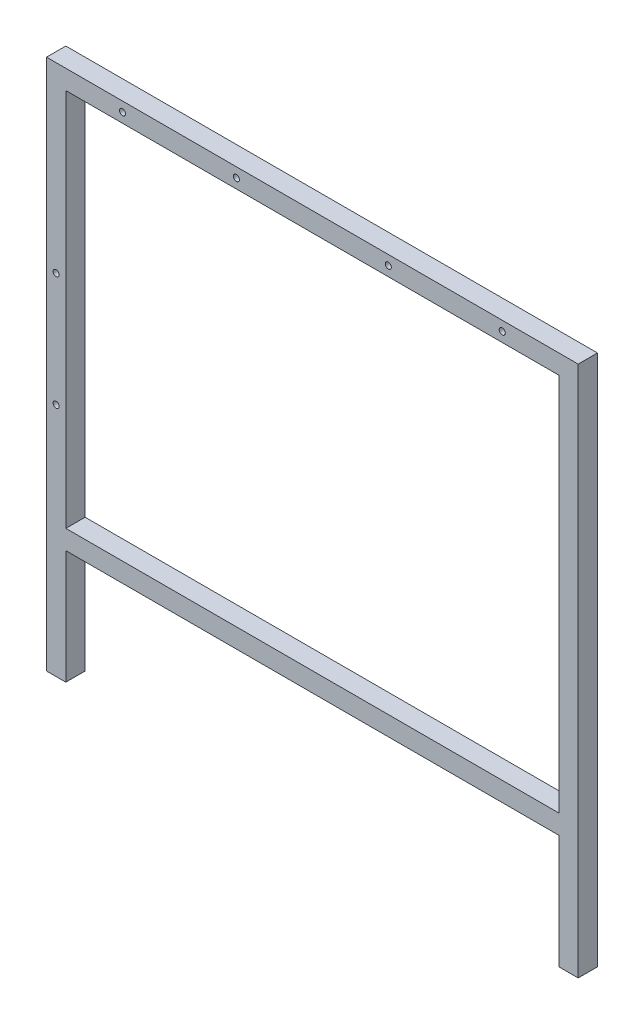
ISO-10303-21;
HEADER;
FILE_DESCRIPTION(('STEP AP214'),'2;1');
FILE_NAME('part.step','',(''),(''),'','','');
FILE_SCHEMA(('AUTOMOTIVE_DESIGN { 1 0 10303 214 1 1 1 1 }'));
ENDSEC;
DATA;
#1=APPLICATION_CONTEXT('core data for automotive mechanical design processes');
#2=APPLICATION_PROTOCOL_DEFINITION('international standard','automotive_design',2000,#1);
#3=PRODUCT_CONTEXT('',#1,'mechanical');
#4=PRODUCT('Part','Part','',(#3));
#5=PRODUCT_RELATED_PRODUCT_CATEGORY('part','',(#4));
#6=PRODUCT_DEFINITION_FORMATION('','',#4);
#7=PRODUCT_DEFINITION_CONTEXT('part definition',#1,'design');
#8=PRODUCT_DEFINITION('design','',#6,#7);
#9=PRODUCT_DEFINITION_SHAPE('','',#8);
#10=(LENGTH_UNIT() NAMED_UNIT(*) SI_UNIT(.MILLI.,.METRE.));
#11=(NAMED_UNIT(*) PLANE_ANGLE_UNIT() SI_UNIT($,.RADIAN.));
#12=(NAMED_UNIT(*) SI_UNIT($,.STERADIAN.) SOLID_ANGLE_UNIT());
#13=UNCERTAINTY_MEASURE_WITH_UNIT(LENGTH_MEASURE(1.E-05),#10,'distance_accuracy_value','');
#14=(GEOMETRIC_REPRESENTATION_CONTEXT(3) GLOBAL_UNCERTAINTY_ASSIGNED_CONTEXT((#13)) GLOBAL_UNIT_ASSIGNED_CONTEXT((#10,
#11,#12)) REPRESENTATION_CONTEXT('',''));
#15=CARTESIAN_POINT('',(0.,0.,0.));
#16=DIRECTION('',(0.,0.,1.));
#17=DIRECTION('',(1.,0.,0.));
#18=AXIS2_PLACEMENT_3D('',#15,#16,#17);
#19=CARTESIAN_POINT('',(25.4000000000001,0.,-25.4));
#20=DIRECTION('',(1.,0.,0.));
#21=DIRECTION('',(0.,0.,-1.));
#22=AXIS2_PLACEMENT_3D('',#19,#20,#21);
#23=PLANE('',#22);
#24=DIRECTION('',(0.,1.,0.));
#25=VECTOR('',#24,1.);
#26=CARTESIAN_POINT('',(25.4000000000001,0.,0.));
#27=LINE('',#26,#25);
#28=CARTESIAN_POINT('',(25.4000000000001,-700.,0.));
#29=VERTEX_POINT('',#28);
#30=CARTESIAN_POINT('',(25.4000000000001,-550.,0.));
#31=VERTEX_POINT('',#30);
#32=EDGE_CURVE('E168',#29,#31,#27,.T.);
#33=ORIENTED_EDGE('',*,*,#32,.F.);
#34=DIRECTION('',(0.,0.,1.));
#35=VECTOR('',#34,1.);
#36=CARTESIAN_POINT('',(25.4000000000001,-700.,-25.4));
#37=LINE('',#36,#35);
#38=CARTESIAN_POINT('',(25.4000000000001,-700.,-25.4));
#39=VERTEX_POINT('',#38);
#40=EDGE_CURVE('E11',#39,#29,#37,.T.);
#41=ORIENTED_EDGE('',*,*,#40,.F.);
#42=DIRECTION('',(0.,1.,0.));
#43=VECTOR('',#42,1.);
#44=CARTESIAN_POINT('',(25.4000000000001,0.,-25.4));
#45=LINE('',#44,#43);
#46=CARTESIAN_POINT('',(25.4000000000001,-550.,-25.4));
#47=VERTEX_POINT('',#46);
#48=EDGE_CURVE('E221',#39,#47,#45,.T.);
#49=ORIENTED_EDGE('',*,*,#48,.T.);
#50=DIRECTION('',(0.,0.,1.));
#51=VECTOR('',#50,1.);
#52=CARTESIAN_POINT('',(25.4000000000001,-550.,-25.4));
#53=LINE('',#52,#51);
#54=EDGE_CURVE('E196',#47,#31,#53,.T.);
#55=ORIENTED_EDGE('',*,*,#54,.T.);
#56=EDGE_LOOP('',(#33,#41,#49,#55));
#57=FACE_BOUND('',#56,.T.);
#58=ADVANCED_FACE('F36',(#57),#23,.T.);
#59=CARTESIAN_POINT('',(0.,-700.,-25.4));
#60=DIRECTION('',(0.,-1.,0.));
#61=DIRECTION('',(0.,0.,-1.));
#62=AXIS2_PLACEMENT_3D('',#59,#60,#61);
#63=PLANE('',#62);
#64=DIRECTION('',(1.,0.,0.));
#65=VECTOR('',#64,1.);
#66=CARTESIAN_POINT('',(0.,-700.,0.));
#67=LINE('',#66,#65);
#68=CARTESIAN_POINT('',(0.,-700.,0.));
#69=VERTEX_POINT('',#68);
#70=EDGE_CURVE('E183',#69,#29,#67,.T.);
#71=ORIENTED_EDGE('',*,*,#70,.F.);
#72=DIRECTION('',(0.,0.,1.));
#73=VECTOR('',#72,1.);
#74=CARTESIAN_POINT('',(0.,-700.,-25.4));
#75=LINE('',#74,#73);
#76=CARTESIAN_POINT('',(0.,-700.,-25.4));
#77=VERTEX_POINT('',#76);
#78=EDGE_CURVE('E46',#77,#69,#75,.T.);
#79=ORIENTED_EDGE('',*,*,#78,.F.);
#80=DIRECTION('',(1.,0.,0.));
#81=VECTOR('',#80,1.);
#82=CARTESIAN_POINT('',(0.,-700.,-25.4));
#83=LINE('',#82,#81);
#84=EDGE_CURVE('E152',#77,#39,#83,.T.);
#85=ORIENTED_EDGE('',*,*,#84,.T.);
#86=ORIENTED_EDGE('',*,*,#40,.T.);
#87=EDGE_LOOP('',(#71,#79,#85,#86));
#88=FACE_BOUND('',#87,.T.);
#89=ADVANCED_FACE('F265',(#88),#63,.T.);
#90=CARTESIAN_POINT('',(0.,0.,-25.4));
#91=DIRECTION('',(-1.,0.,0.));
#92=DIRECTION('',(0.,-1.,0.));
#93=AXIS2_PLACEMENT_3D('',#90,#91,#92);
#94=PLANE('',#93);
#95=DIRECTION('',(0.,-1.,0.));
#96=VECTOR('',#95,1.);
#97=CARTESIAN_POINT('',(0.,0.,0.));
#98=LINE('',#97,#96);
#99=CARTESIAN_POINT('',(0.,0.,0.));
#100=VERTEX_POINT('',#99);
#101=EDGE_CURVE('E137',#100,#69,#98,.T.);
#102=ORIENTED_EDGE('',*,*,#101,.F.);
#103=DIRECTION('',(0.,0.,1.));
#104=VECTOR('',#103,1.);
#105=CARTESIAN_POINT('',(0.,0.,-25.4));
#106=LINE('',#105,#104);
#107=CARTESIAN_POINT('',(0.,0.,-25.4));
#108=VERTEX_POINT('',#107);
#109=EDGE_CURVE('E131',#108,#100,#106,.T.);
#110=ORIENTED_EDGE('',*,*,#109,.F.);
#111=DIRECTION('',(0.,-1.,0.));
#112=VECTOR('',#111,1.);
#113=CARTESIAN_POINT('',(0.,0.,-25.4));
#114=LINE('',#113,#112);
#115=EDGE_CURVE('E135',#108,#77,#114,.T.);
#116=ORIENTED_EDGE('',*,*,#115,.T.);
#117=ORIENTED_EDGE('',*,*,#78,.T.);
#118=EDGE_LOOP('',(#102,#110,#116,#117));
#119=FACE_BOUND('',#118,.T.);
#120=ADVANCED_FACE('F133',(#119),#94,.T.);
#121=CARTESIAN_POINT('',(0.,0.,-25.4));
#122=DIRECTION('',(0.,-1.,0.));
#123=DIRECTION('',(0.,0.,-1.));
#124=AXIS2_PLACEMENT_3D('',#121,#122,#123);
#125=PLANE('',#124);
#126=DIRECTION('',(1.,0.,0.));
#127=VECTOR('',#126,1.);
#128=CARTESIAN_POINT('',(0.,0.,0.));
#129=LINE('',#128,#127);
#130=CARTESIAN_POINT('',(700.,0.,0.));
#131=VERTEX_POINT('',#130);
#132=EDGE_CURVE('E180',#100,#131,#129,.T.);
#133=ORIENTED_EDGE('',*,*,#132,.T.);
#134=DIRECTION('',(0.,0.,1.));
#135=VECTOR('',#134,1.);
#136=CARTESIAN_POINT('',(700.,0.,-25.4));
#137=LINE('',#136,#135);
#138=CARTESIAN_POINT('',(700.,0.,-25.4));
#139=VERTEX_POINT('',#138);
#140=EDGE_CURVE('E141',#139,#131,#137,.T.);
#141=ORIENTED_EDGE('',*,*,#140,.F.);
#142=DIRECTION('',(1.,0.,0.));
#143=VECTOR('',#142,1.);
#144=CARTESIAN_POINT('',(0.,0.,-25.4));
#145=LINE('',#144,#143);
#146=EDGE_CURVE('E144',#108,#139,#145,.T.);
#147=ORIENTED_EDGE('',*,*,#146,.F.);
#148=ORIENTED_EDGE('',*,*,#109,.T.);
#149=EDGE_LOOP('',(#133,#141,#147,#148));
#150=FACE_BOUND('',#149,.T.);
#151=ADVANCED_FACE('F145',(#150),#125,.F.);
#152=CARTESIAN_POINT('',(700.,0.,-25.4));
#153=DIRECTION('',(1.,0.,0.));
#154=DIRECTION('',(0.,0.,-1.));
#155=AXIS2_PLACEMENT_3D('',#152,#153,#154);
#156=PLANE('',#155);
#157=DIRECTION('',(0.,1.,0.));
#158=VECTOR('',#157,1.);
#159=CARTESIAN_POINT('',(700.,0.,0.));
#160=LINE('',#159,#158);
#161=CARTESIAN_POINT('',(700.,-700.,0.));
#162=VERTEX_POINT('',#161);
#163=EDGE_CURVE('E177',#162,#131,#160,.T.);
#164=ORIENTED_EDGE('',*,*,#163,.F.);
#165=DIRECTION('',(0.,0.,1.));
#166=VECTOR('',#165,1.);
#167=CARTESIAN_POINT('',(700.,-700.,-25.4));
#168=LINE('',#167,#166);
#169=CARTESIAN_POINT('',(700.,-700.,-25.4));
#170=VERTEX_POINT('',#169);
#171=EDGE_CURVE('E189',#170,#162,#168,.T.);
#172=ORIENTED_EDGE('',*,*,#171,.F.);
#173=DIRECTION('',(0.,1.,0.));
#174=VECTOR('',#173,1.);
#175=CARTESIAN_POINT('',(700.,0.,-25.4));
#176=LINE('',#175,#174);
#177=EDGE_CURVE('E149',#170,#139,#176,.T.);
#178=ORIENTED_EDGE('',*,*,#177,.T.);
#179=ORIENTED_EDGE('',*,*,#140,.T.);
#180=EDGE_LOOP('',(#164,#172,#178,#179));
#181=FACE_BOUND('',#180,.T.);
#182=ADVANCED_FACE('F235',(#181),#156,.T.);
#183=CARTESIAN_POINT('',(0.,-700.,-25.4));
#184=DIRECTION('',(0.,1.,0.));
#185=DIRECTION('',(0.,0.,1.));
#186=AXIS2_PLACEMENT_3D('',#183,#184,#185);
#187=PLANE('',#186);
#188=DIRECTION('',(-1.,0.,0.));
#189=VECTOR('',#188,1.);
#190=CARTESIAN_POINT('',(0.,-700.,0.));
#191=LINE('',#190,#189);
#192=CARTESIAN_POINT('',(674.6,-700.,0.));
#193=VERTEX_POINT('',#192);
#194=EDGE_CURVE('E174',#162,#193,#191,.T.);
#195=ORIENTED_EDGE('',*,*,#194,.T.);
#196=DIRECTION('',(0.,0.,1.));
#197=VECTOR('',#196,1.);
#198=CARTESIAN_POINT('',(674.6,-700.,-25.4));
#199=LINE('',#198,#197);
#200=CARTESIAN_POINT('',(674.6,-700.,-25.4));
#201=VERTEX_POINT('',#200);
#202=EDGE_CURVE('E191',#201,#193,#199,.T.);
#203=ORIENTED_EDGE('',*,*,#202,.F.);
#204=DIRECTION('',(-1.,0.,0.));
#205=VECTOR('',#204,1.);
#206=CARTESIAN_POINT('',(0.,-700.,-25.4));
#207=LINE('',#206,#205);
#208=EDGE_CURVE('E231',#170,#201,#207,.T.);
#209=ORIENTED_EDGE('',*,*,#208,.F.);
#210=ORIENTED_EDGE('',*,*,#171,.T.);
#211=EDGE_LOOP('',(#195,#203,#209,#210));
#212=FACE_BOUND('',#211,.T.);
#213=ADVANCED_FACE('F241',(#212),#187,.F.);
#214=CARTESIAN_POINT('',(674.6,0.,-25.4));
#215=DIRECTION('',(1.,0.,0.));
#216=DIRECTION('',(0.,0.,-1.));
#217=AXIS2_PLACEMENT_3D('',#214,#215,#216);
#218=PLANE('',#217);
#219=DIRECTION('',(0.,1.,0.));
#220=VECTOR('',#219,1.);
#221=CARTESIAN_POINT('',(674.6,0.,0.));
#222=LINE('',#221,#220);
#223=CARTESIAN_POINT('',(674.6,-550.,0.));
#224=VERTEX_POINT('',#223);
#225=EDGE_CURVE('E162',#193,#224,#222,.T.);
#226=ORIENTED_EDGE('',*,*,#225,.T.);
#227=DIRECTION('',(0.,0.,1.));
#228=VECTOR('',#227,1.);
#229=CARTESIAN_POINT('',(674.6,-550.,-25.4));
#230=LINE('',#229,#228);
#231=CARTESIAN_POINT('',(674.6,-550.,-25.4));
#232=VERTEX_POINT('',#231);
#233=EDGE_CURVE('E194',#232,#224,#230,.T.);
#234=ORIENTED_EDGE('',*,*,#233,.F.);
#235=DIRECTION('',(0.,1.,0.));
#236=VECTOR('',#235,1.);
#237=CARTESIAN_POINT('',(674.6,0.,-25.4));
#238=LINE('',#237,#236);
#239=EDGE_CURVE('E230',#201,#232,#238,.T.);
#240=ORIENTED_EDGE('',*,*,#239,.F.);
#241=ORIENTED_EDGE('',*,*,#202,.T.);
#242=EDGE_LOOP('',(#226,#234,#240,#241));
#243=FACE_BOUND('',#242,.T.);
#244=ADVANCED_FACE('F245',(#243),#218,.F.);
#245=CARTESIAN_POINT('',(674.6,-524.6,0.));
#246=VERTEX_POINT('',#245);
#247=CARTESIAN_POINT('',(674.6,-25.4,0.));
#248=VERTEX_POINT('',#247);
#249=EDGE_CURVE('E157',#246,#248,#222,.T.);
#250=ORIENTED_EDGE('',*,*,#249,.T.);
#251=DIRECTION('',(0.,0.,1.));
#252=VECTOR('',#251,1.);
#253=CARTESIAN_POINT('',(674.6,-25.4,-25.4));
#254=LINE('',#253,#252);
#255=CARTESIAN_POINT('',(674.6,-25.4,-25.4));
#256=VERTEX_POINT('',#255);
#257=EDGE_CURVE('E198',#256,#248,#254,.T.);
#258=ORIENTED_EDGE('',*,*,#257,.F.);
#259=CARTESIAN_POINT('',(674.6,-524.6,-25.4));
#260=VERTEX_POINT('',#259);
#261=EDGE_CURVE('E185',#260,#256,#238,.T.);
#262=ORIENTED_EDGE('',*,*,#261,.F.);
#263=DIRECTION('',(0.,0.,1.));
#264=VECTOR('',#263,1.);
#265=CARTESIAN_POINT('',(674.6,-524.6,-25.4));
#266=LINE('',#265,#264);
#267=EDGE_CURVE('E40',#260,#246,#266,.T.);
#268=ORIENTED_EDGE('',*,*,#267,.T.);
#269=EDGE_LOOP('',(#250,#258,#262,#268));
#270=FACE_BOUND('',#269,.T.);
#271=ADVANCED_FACE('F208',(#270),#218,.F.);
#272=CARTESIAN_POINT('',(0.,-25.4,-25.4));
#273=DIRECTION('',(0.,-1.,0.));
#274=DIRECTION('',(0.,0.,-1.));
#275=AXIS2_PLACEMENT_3D('',#272,#273,#274);
#276=PLANE('',#275);
#277=DIRECTION('',(1.,0.,0.));
#278=VECTOR('',#277,1.);
#279=CARTESIAN_POINT('',(0.,-25.4,0.));
#280=LINE('',#279,#278);
#281=CARTESIAN_POINT('',(25.4000000000001,-25.4,0.));
#282=VERTEX_POINT('',#281);
#283=EDGE_CURVE('E167',#282,#248,#280,.T.);
#284=ORIENTED_EDGE('',*,*,#283,.F.);
#285=DIRECTION('',(0.,0.,1.));
#286=VECTOR('',#285,1.);
#287=CARTESIAN_POINT('',(25.4000000000001,-25.4,-25.4));
#288=LINE('',#287,#286);
#289=CARTESIAN_POINT('',(25.4000000000001,-25.4,-25.4));
#290=VERTEX_POINT('',#289);
#291=EDGE_CURVE('E200',#290,#282,#288,.T.);
#292=ORIENTED_EDGE('',*,*,#291,.F.);
#293=DIRECTION('',(1.,0.,0.));
#294=VECTOR('',#293,1.);
#295=CARTESIAN_POINT('',(0.,-25.4,-25.4));
#296=LINE('',#295,#294);
#297=EDGE_CURVE('E220',#290,#256,#296,.T.);
#298=ORIENTED_EDGE('',*,*,#297,.T.);
#299=ORIENTED_EDGE('',*,*,#257,.T.);
#300=EDGE_LOOP('',(#284,#292,#298,#299));
#301=FACE_BOUND('',#300,.T.);
#302=ADVANCED_FACE('F216',(#301),#276,.T.);
#303=CARTESIAN_POINT('',(25.4000000000001,-524.6,0.));
#304=VERTEX_POINT('',#303);
#305=EDGE_CURVE('E164',#304,#282,#27,.T.);
#306=ORIENTED_EDGE('',*,*,#305,.F.);
#307=DIRECTION('',(0.,0.,1.));
#308=VECTOR('',#307,1.);
#309=CARTESIAN_POINT('',(25.4000000000001,-524.6,-25.4));
#310=LINE('',#309,#308);
#311=CARTESIAN_POINT('',(25.4000000000001,-524.6,-25.4));
#312=VERTEX_POINT('',#311);
#313=EDGE_CURVE('E201',#312,#304,#310,.T.);
#314=ORIENTED_EDGE('',*,*,#313,.F.);
#315=EDGE_CURVE('E222',#312,#290,#45,.T.);
#316=ORIENTED_EDGE('',*,*,#315,.T.);
#317=ORIENTED_EDGE('',*,*,#291,.T.);
#318=EDGE_LOOP('',(#306,#314,#316,#317));
#319=FACE_BOUND('',#318,.T.);
#320=ADVANCED_FACE('F267',(#319),#23,.T.);
#321=CARTESIAN_POINT('',(0.,-524.6,-25.4));
#322=DIRECTION('',(0.,-1.,0.));
#323=DIRECTION('',(0.,0.,-1.));
#324=AXIS2_PLACEMENT_3D('',#321,#322,#323);
#325=PLANE('',#324);
#326=DIRECTION('',(1.,0.,0.));
#327=VECTOR('',#326,1.);
#328=CARTESIAN_POINT('',(0.,-524.6,0.));
#329=LINE('',#328,#327);
#330=EDGE_CURVE('E160',#304,#246,#329,.T.);
#331=ORIENTED_EDGE('',*,*,#330,.T.);
#332=ORIENTED_EDGE('',*,*,#267,.F.);
#333=DIRECTION('',(1.,0.,0.));
#334=VECTOR('',#333,1.);
#335=CARTESIAN_POINT('',(0.,-524.6,-25.4));
#336=LINE('',#335,#334);
#337=EDGE_CURVE('E106',#312,#260,#336,.T.);
#338=ORIENTED_EDGE('',*,*,#337,.F.);
#339=ORIENTED_EDGE('',*,*,#313,.T.);
#340=EDGE_LOOP('',(#331,#332,#338,#339));
#341=FACE_BOUND('',#340,.T.);
#342=ADVANCED_FACE('F38',(#341),#325,.F.);
#343=CARTESIAN_POINT('',(0.,-550.,-25.4));
#344=DIRECTION('',(0.,-1.,0.));
#345=DIRECTION('',(0.,0.,-1.));
#346=AXIS2_PLACEMENT_3D('',#343,#344,#345);
#347=PLANE('',#346);
#348=DIRECTION('',(1.,0.,0.));
#349=VECTOR('',#348,1.);
#350=CARTESIAN_POINT('',(0.,-550.,0.));
#351=LINE('',#350,#349);
#352=EDGE_CURVE('E171',#31,#224,#351,.T.);
#353=ORIENTED_EDGE('',*,*,#352,.F.);
#354=ORIENTED_EDGE('',*,*,#54,.F.);
#355=DIRECTION('',(1.,0.,0.));
#356=VECTOR('',#355,1.);
#357=CARTESIAN_POINT('',(0.,-550.,-25.4));
#358=LINE('',#357,#356);
#359=EDGE_CURVE('E224',#47,#232,#358,.T.);
#360=ORIENTED_EDGE('',*,*,#359,.T.);
#361=ORIENTED_EDGE('',*,*,#233,.T.);
#362=EDGE_LOOP('',(#353,#354,#360,#361));
#363=FACE_BOUND('',#362,.T.);
#364=ADVANCED_FACE('F249',(#363),#347,.T.);
#365=CARTESIAN_POINT('',(0.,0.,-25.4));
#366=DIRECTION('',(0.,0.,1.));
#367=DIRECTION('',(1.,0.,0.));
#368=AXIS2_PLACEMENT_3D('',#365,#366,#367);
#369=PLANE('',#368);
#370=CARTESIAN_POINT('',(100.,-12.7,-25.4));
#371=DIRECTION('',(0.,0.,1.));
#372=DIRECTION('',(1.,0.,0.));
#373=AXIS2_PLACEMENT_3D('',#370,#371,#372);
#374=CIRCLE('',#373,4.00000000000001);
#375=CARTESIAN_POINT('',(104.,-12.7,-25.4));
#376=VERTEX_POINT('',#375);
#377=EDGE_CURVE('E415',#376,#376,#374,.T.);
#378=ORIENTED_EDGE('',*,*,#377,.T.);
#379=EDGE_LOOP('',(#378));
#380=FACE_BOUND('',#379,.T.);
#381=CARTESIAN_POINT('',(250.,-12.7,-25.4));
#382=DIRECTION('',(0.,0.,1.));
#383=DIRECTION('',(1.,0.,0.));
#384=AXIS2_PLACEMENT_3D('',#381,#382,#383);
#385=CIRCLE('',#384,4.00000000000002);
#386=CARTESIAN_POINT('',(254.,-12.7,-25.4));
#387=VERTEX_POINT('',#386);
#388=EDGE_CURVE('E424',#387,#387,#385,.T.);
#389=ORIENTED_EDGE('',*,*,#388,.T.);
#390=EDGE_LOOP('',(#389));
#391=FACE_BOUND('',#390,.T.);
#392=CARTESIAN_POINT('',(450.,-12.7,-25.4));
#393=DIRECTION('',(0.,0.,1.));
#394=DIRECTION('',(1.,0.,0.));
#395=AXIS2_PLACEMENT_3D('',#392,#393,#394);
#396=CIRCLE('',#395,3.99999999999999);
#397=CARTESIAN_POINT('',(454.,-12.7,-25.4));
#398=VERTEX_POINT('',#397);
#399=EDGE_CURVE('E432',#398,#398,#396,.T.);
#400=ORIENTED_EDGE('',*,*,#399,.T.);
#401=EDGE_LOOP('',(#400));
#402=FACE_BOUND('',#401,.T.);
#403=CARTESIAN_POINT('',(600.,-12.7,-25.4));
#404=DIRECTION('',(0.,0.,1.));
#405=DIRECTION('',(1.,0.,0.));
#406=AXIS2_PLACEMENT_3D('',#403,#404,#405);
#407=CIRCLE('',#406,3.99999999999999);
#408=CARTESIAN_POINT('',(604.,-12.7,-25.4));
#409=VERTEX_POINT('',#408);
#410=EDGE_CURVE('E438',#409,#409,#407,.T.);
#411=ORIENTED_EDGE('',*,*,#410,.T.);
#412=EDGE_LOOP('',(#411));
#413=FACE_BOUND('',#412,.T.);
#414=CARTESIAN_POINT('',(12.7000000000001,-240.,-25.4));
#415=DIRECTION('',(0.,0.,1.));
#416=DIRECTION('',(1.,0.,0.));
#417=AXIS2_PLACEMENT_3D('',#414,#415,#416);
#418=CIRCLE('',#417,4.00000000000001);
#419=CARTESIAN_POINT('',(16.7000000000001,-240.,-25.4));
#420=VERTEX_POINT('',#419);
#421=EDGE_CURVE('E161',#420,#420,#418,.T.);
#422=ORIENTED_EDGE('',*,*,#421,.T.);
#423=EDGE_LOOP('',(#422));
#424=FACE_BOUND('',#423,.T.);
#425=CARTESIAN_POINT('',(12.7000000000001,-390.,-25.4));
#426=DIRECTION('',(0.,0.,1.));
#427=DIRECTION('',(1.,0.,0.));
#428=AXIS2_PLACEMENT_3D('',#425,#426,#427);
#429=CIRCLE('',#428,4.00000000000001);
#430=CARTESIAN_POINT('',(16.7000000000001,-390.,-25.4));
#431=VERTEX_POINT('',#430);
#432=EDGE_CURVE('E446',#431,#431,#429,.T.);
#433=ORIENTED_EDGE('',*,*,#432,.T.);
#434=EDGE_LOOP('',(#433));
#435=FACE_BOUND('',#434,.T.);
#436=ORIENTED_EDGE('',*,*,#261,.T.);
#437=ORIENTED_EDGE('',*,*,#297,.F.);
#438=ORIENTED_EDGE('',*,*,#315,.F.);
#439=ORIENTED_EDGE('',*,*,#337,.T.);
#440=EDGE_LOOP('',(#436,#437,#438,#439));
#441=FACE_BOUND('',#440,.T.);
#442=ORIENTED_EDGE('',*,*,#48,.F.);
#443=ORIENTED_EDGE('',*,*,#84,.F.);
#444=ORIENTED_EDGE('',*,*,#115,.F.);
#445=ORIENTED_EDGE('',*,*,#146,.T.);
#446=ORIENTED_EDGE('',*,*,#177,.F.);
#447=ORIENTED_EDGE('',*,*,#208,.T.);
#448=ORIENTED_EDGE('',*,*,#239,.T.);
#449=ORIENTED_EDGE('',*,*,#359,.F.);
#450=EDGE_LOOP('',(#442,#443,#444,#445,#446,#447,#448,#449));
#451=FACE_BOUND('',#450,.T.);
#452=ADVANCED_FACE('F151',(#380,#391,#402,#413,#424,#435,#441,#451),#369,.F.);
#453=CARTESIAN_POINT('',(0.,0.,0.));
#454=DIRECTION('',(0.,0.,1.));
#455=DIRECTION('',(1.,0.,0.));
#456=AXIS2_PLACEMENT_3D('',#453,#454,#455);
#457=PLANE('',#456);
#458=CARTESIAN_POINT('',(100.,-12.7,0.));
#459=DIRECTION('',(0.,0.,1.));
#460=DIRECTION('',(1.,0.,0.));
#461=AXIS2_PLACEMENT_3D('',#458,#459,#460);
#462=CIRCLE('',#461,4.00000000000001);
#463=CARTESIAN_POINT('',(104.,-12.7,0.));
#464=VERTEX_POINT('',#463);
#465=EDGE_CURVE('E418',#464,#464,#462,.T.);
#466=ORIENTED_EDGE('',*,*,#465,.F.);
#467=EDGE_LOOP('',(#466));
#468=FACE_BOUND('',#467,.T.);
#469=CARTESIAN_POINT('',(250.,-12.7,0.));
#470=DIRECTION('',(0.,0.,1.));
#471=DIRECTION('',(1.,0.,0.));
#472=AXIS2_PLACEMENT_3D('',#469,#470,#471);
#473=CIRCLE('',#472,4.00000000000002);
#474=CARTESIAN_POINT('',(254.,-12.7,0.));
#475=VERTEX_POINT('',#474);
#476=EDGE_CURVE('E419',#475,#475,#473,.T.);
#477=ORIENTED_EDGE('',*,*,#476,.F.);
#478=EDGE_LOOP('',(#477));
#479=FACE_BOUND('',#478,.T.);
#480=CARTESIAN_POINT('',(450.,-12.7,0.));
#481=DIRECTION('',(0.,0.,1.));
#482=DIRECTION('',(1.,0.,0.));
#483=AXIS2_PLACEMENT_3D('',#480,#481,#482);
#484=CIRCLE('',#483,3.99999999999999);
#485=CARTESIAN_POINT('',(454.,-12.7,0.));
#486=VERTEX_POINT('',#485);
#487=EDGE_CURVE('E429',#486,#486,#484,.T.);
#488=ORIENTED_EDGE('',*,*,#487,.F.);
#489=EDGE_LOOP('',(#488));
#490=FACE_BOUND('',#489,.T.);
#491=CARTESIAN_POINT('',(600.,-12.7,0.));
#492=DIRECTION('',(0.,0.,1.));
#493=DIRECTION('',(1.,0.,0.));
#494=AXIS2_PLACEMENT_3D('',#491,#492,#493);
#495=CIRCLE('',#494,3.99999999999999);
#496=CARTESIAN_POINT('',(604.,-12.7,0.));
#497=VERTEX_POINT('',#496);
#498=EDGE_CURVE('E435',#497,#497,#495,.T.);
#499=ORIENTED_EDGE('',*,*,#498,.F.);
#500=EDGE_LOOP('',(#499));
#501=FACE_BOUND('',#500,.T.);
#502=CARTESIAN_POINT('',(12.7000000000001,-240.,0.));
#503=DIRECTION('',(0.,0.,1.));
#504=DIRECTION('',(1.,0.,0.));
#505=AXIS2_PLACEMENT_3D('',#502,#503,#504);
#506=CIRCLE('',#505,4.00000000000001);
#507=CARTESIAN_POINT('',(16.7000000000001,-240.,0.));
#508=VERTEX_POINT('',#507);
#509=EDGE_CURVE('E443',#508,#508,#506,.T.);
#510=ORIENTED_EDGE('',*,*,#509,.F.);
#511=EDGE_LOOP('',(#510));
#512=FACE_BOUND('',#511,.T.);
#513=CARTESIAN_POINT('',(12.7000000000001,-390.,0.));
#514=DIRECTION('',(0.,0.,1.));
#515=DIRECTION('',(1.,0.,0.));
#516=AXIS2_PLACEMENT_3D('',#513,#514,#515);
#517=CIRCLE('',#516,4.00000000000001);
#518=CARTESIAN_POINT('',(16.7000000000001,-390.,0.));
#519=VERTEX_POINT('',#518);
#520=EDGE_CURVE('E421',#519,#519,#517,.T.);
#521=ORIENTED_EDGE('',*,*,#520,.F.);
#522=EDGE_LOOP('',(#521));
#523=FACE_BOUND('',#522,.T.);
#524=ORIENTED_EDGE('',*,*,#249,.F.);
#525=ORIENTED_EDGE('',*,*,#330,.F.);
#526=ORIENTED_EDGE('',*,*,#305,.T.);
#527=ORIENTED_EDGE('',*,*,#283,.T.);
#528=EDGE_LOOP('',(#524,#525,#526,#527));
#529=FACE_BOUND('',#528,.T.);
#530=ORIENTED_EDGE('',*,*,#32,.T.);
#531=ORIENTED_EDGE('',*,*,#352,.T.);
#532=ORIENTED_EDGE('',*,*,#225,.F.);
#533=ORIENTED_EDGE('',*,*,#194,.F.);
#534=ORIENTED_EDGE('',*,*,#163,.T.);
#535=ORIENTED_EDGE('',*,*,#132,.F.);
#536=ORIENTED_EDGE('',*,*,#101,.T.);
#537=ORIENTED_EDGE('',*,*,#70,.T.);
#538=EDGE_LOOP('',(#530,#531,#532,#533,#534,#535,#536,#537));
#539=FACE_BOUND('',#538,.T.);
#540=ADVANCED_FACE('F211',(#468,#479,#490,#501,#512,#523,#529,#539),#457,.T.);
#541=CARTESIAN_POINT('',(12.7000000000001,-390.,-25.4));
#542=DIRECTION('',(0.,0.,1.));
#543=DIRECTION('',(1.,0.,0.));
#544=AXIS2_PLACEMENT_3D('',#541,#542,#543);
#545=CYLINDRICAL_SURFACE('',#544,4.00000000000001);
#546=ORIENTED_EDGE('',*,*,#432,.F.);
#547=EDGE_LOOP('',(#546));
#548=FACE_BOUND('',#547,.T.);
#549=ORIENTED_EDGE('',*,*,#520,.T.);
#550=EDGE_LOOP('',(#549));
#551=FACE_BOUND('',#550,.T.);
#552=ADVANCED_FACE('F256',(#548,#551),#545,.F.);
#553=CARTESIAN_POINT('',(12.7000000000001,-240.,-25.4));
#554=DIRECTION('',(0.,0.,1.));
#555=DIRECTION('',(1.,0.,0.));
#556=AXIS2_PLACEMENT_3D('',#553,#554,#555);
#557=CYLINDRICAL_SURFACE('',#556,4.00000000000001);
#558=ORIENTED_EDGE('',*,*,#421,.F.);
#559=EDGE_LOOP('',(#558));
#560=FACE_BOUND('',#559,.T.);
#561=ORIENTED_EDGE('',*,*,#509,.T.);
#562=EDGE_LOOP('',(#561));
#563=FACE_BOUND('',#562,.T.);
#564=ADVANCED_FACE('F347',(#560,#563),#557,.F.);
#565=CARTESIAN_POINT('',(600.,-12.7,-25.4));
#566=DIRECTION('',(0.,0.,1.));
#567=DIRECTION('',(1.,0.,0.));
#568=AXIS2_PLACEMENT_3D('',#565,#566,#567);
#569=CYLINDRICAL_SURFACE('',#568,3.99999999999999);
#570=ORIENTED_EDGE('',*,*,#410,.F.);
#571=EDGE_LOOP('',(#570));
#572=FACE_BOUND('',#571,.T.);
#573=ORIENTED_EDGE('',*,*,#498,.T.);
#574=EDGE_LOOP('',(#573));
#575=FACE_BOUND('',#574,.T.);
#576=ADVANCED_FACE('F356',(#572,#575),#569,.F.);
#577=CARTESIAN_POINT('',(450.,-12.7,-25.4));
#578=DIRECTION('',(0.,0.,1.));
#579=DIRECTION('',(1.,0.,0.));
#580=AXIS2_PLACEMENT_3D('',#577,#578,#579);
#581=CYLINDRICAL_SURFACE('',#580,3.99999999999999);
#582=ORIENTED_EDGE('',*,*,#399,.F.);
#583=EDGE_LOOP('',(#582));
#584=FACE_BOUND('',#583,.T.);
#585=ORIENTED_EDGE('',*,*,#487,.T.);
#586=EDGE_LOOP('',(#585));
#587=FACE_BOUND('',#586,.T.);
#588=ADVANCED_FACE('F379',(#584,#587),#581,.F.);
#589=CARTESIAN_POINT('',(250.,-12.7,-25.4));
#590=DIRECTION('',(0.,0.,1.));
#591=DIRECTION('',(1.,0.,0.));
#592=AXIS2_PLACEMENT_3D('',#589,#590,#591);
#593=CYLINDRICAL_SURFACE('',#592,4.00000000000002);
#594=ORIENTED_EDGE('',*,*,#388,.F.);
#595=EDGE_LOOP('',(#594));
#596=FACE_BOUND('',#595,.T.);
#597=ORIENTED_EDGE('',*,*,#476,.T.);
#598=EDGE_LOOP('',(#597));
#599=FACE_BOUND('',#598,.T.);
#600=ADVANCED_FACE('F389',(#596,#599),#593,.F.);
#601=CARTESIAN_POINT('',(100.,-12.7,-25.4));
#602=DIRECTION('',(0.,0.,1.));
#603=DIRECTION('',(1.,0.,0.));
#604=AXIS2_PLACEMENT_3D('',#601,#602,#603);
#605=CYLINDRICAL_SURFACE('',#604,4.00000000000001);
#606=ORIENTED_EDGE('',*,*,#377,.F.);
#607=EDGE_LOOP('',(#606));
#608=FACE_BOUND('',#607,.T.);
#609=ORIENTED_EDGE('',*,*,#465,.T.);
#610=EDGE_LOOP('',(#609));
#611=FACE_BOUND('',#610,.T.);
#612=ADVANCED_FACE('F399',(#608,#611),#605,.F.);
#613=CLOSED_SHELL('',(#58,#89,#120,#151,#182,#213,#244,#271,#302,#320,#342,#364,#452,#540,#552,
#564,#576,#588,#600,#612));
#614=MANIFOLD_SOLID_BREP('B2',#613);
#615=ADVANCED_BREP_SHAPE_REPRESENTATION('',(#18,#614),#14);
#616=SHAPE_DEFINITION_REPRESENTATION(#9,#615);
ENDSEC;
END-ISO-10303-21;
